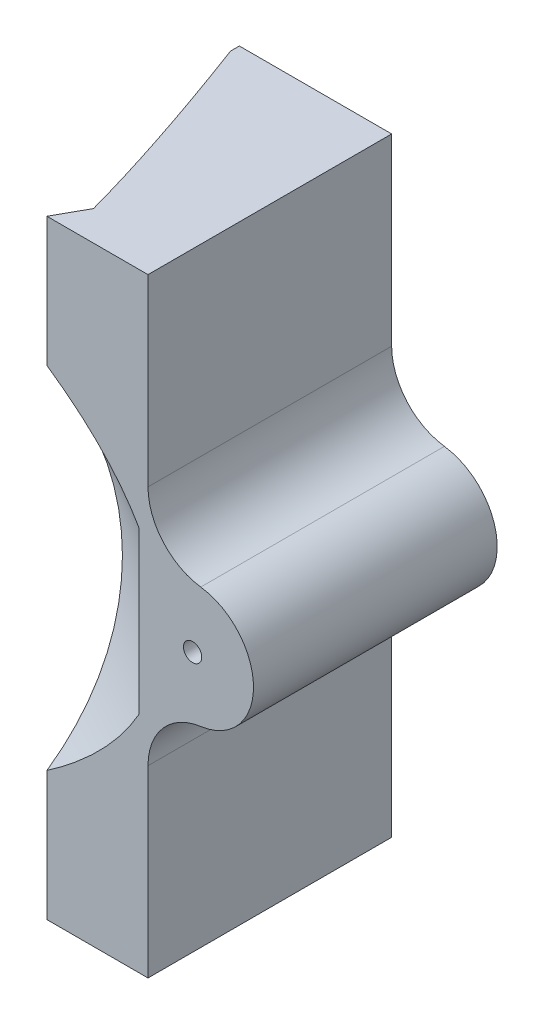
ISO-10303-21;
HEADER;
FILE_DESCRIPTION(('STEP AP214'),'2;1');
FILE_NAME('part.step','',(''),(''),'','','');
FILE_SCHEMA(('AUTOMOTIVE_DESIGN { 1 0 10303 214 1 1 1 1 }'));
ENDSEC;
DATA;
#1=APPLICATION_CONTEXT('core data for automotive mechanical design processes');
#2=APPLICATION_PROTOCOL_DEFINITION('international standard','automotive_design',2000,#1);
#3=PRODUCT_CONTEXT('',#1,'mechanical');
#4=PRODUCT('Part','Part','',(#3));
#5=PRODUCT_RELATED_PRODUCT_CATEGORY('part','',(#4));
#6=PRODUCT_DEFINITION_FORMATION('','',#4);
#7=PRODUCT_DEFINITION_CONTEXT('part definition',#1,'design');
#8=PRODUCT_DEFINITION('design','',#6,#7);
#9=PRODUCT_DEFINITION_SHAPE('','',#8);
#10=(LENGTH_UNIT() NAMED_UNIT(*) SI_UNIT(.MILLI.,.METRE.));
#11=(NAMED_UNIT(*) PLANE_ANGLE_UNIT() SI_UNIT($,.RADIAN.));
#12=(NAMED_UNIT(*) SI_UNIT($,.STERADIAN.) SOLID_ANGLE_UNIT());
#13=UNCERTAINTY_MEASURE_WITH_UNIT(LENGTH_MEASURE(1.E-05),#10,'distance_accuracy_value','');
#14=(GEOMETRIC_REPRESENTATION_CONTEXT(3) GLOBAL_UNCERTAINTY_ASSIGNED_CONTEXT((#13)) GLOBAL_UNIT_ASSIGNED_CONTEXT((#10,
#11,#12)) REPRESENTATION_CONTEXT('',''));
#15=CARTESIAN_POINT('',(0.,0.,0.));
#16=DIRECTION('',(0.,0.,1.));
#17=DIRECTION('',(1.,0.,0.));
#18=AXIS2_PLACEMENT_3D('',#15,#16,#17);
#19=CARTESIAN_POINT('',(0.,2.54,0.));
#20=DIRECTION('',(0.,0.,-1.));
#21=DIRECTION('',(-1.,0.,0.));
#22=AXIS2_PLACEMENT_3D('',#19,#20,#21);
#23=PLANE('',#22);
#24=CARTESIAN_POINT('',(0.,0.,0.));
#25=DIRECTION('',(0.,0.,1.));
#26=DIRECTION('',(1.,0.,0.));
#27=AXIS2_PLACEMENT_3D('',#24,#25,#26);
#28=CIRCLE('',#27,0.381);
#29=CARTESIAN_POINT('',(0.381,0.,0.));
#30=VERTEX_POINT('',#29);
#31=EDGE_CURVE('E287',#30,#30,#28,.T.);
#32=ORIENTED_EDGE('',*,*,#31,.F.);
#33=EDGE_LOOP('',(#32));
#34=FACE_BOUND('',#33,.T.);
#35=DIRECTION('',(0.,-1.,0.));
#36=VECTOR('',#35,1.);
#37=CARTESIAN_POINT('',(-6.07292671785097,2.54,0.));
#38=LINE('',#37,#36);
#39=CARTESIAN_POINT('',(-6.07292671785097,12.7,0.));
#40=VERTEX_POINT('',#39);
#41=CARTESIAN_POINT('',(-6.07292671785097,7.31040088364597,0.));
#42=VERTEX_POINT('',#41);
#43=EDGE_CURVE('E137',#40,#42,#38,.T.);
#44=ORIENTED_EDGE('',*,*,#43,.T.);
#45=CARTESIAN_POINT('',(-27.4936877903365,0.,0.));
#46=DIRECTION('',(0.,0.,-1.));
#47=DIRECTION('',(-1.,0.,0.));
#48=AXIS2_PLACEMENT_3D('',#45,#46,#47);
#49=ELLIPSE('',#48,26.1958498132668,12.7);
#50=CARTESIAN_POINT('',(-2.23284680713486,3.36279204819966,0.));
#51=VERTEX_POINT('',#50);
#52=EDGE_CURVE('E56',#42,#51,#49,.T.);
#53=ORIENTED_EDGE('',*,*,#52,.T.);
#54=DIRECTION('',(0.,-1.,0.));
#55=VECTOR('',#54,1.);
#56=CARTESIAN_POINT('',(-2.23284680713486,-3.36279204819966,0.));
#57=LINE('',#56,#55);
#58=CARTESIAN_POINT('',(-2.23284680713486,-3.36279204819966,0.));
#59=VERTEX_POINT('',#58);
#60=EDGE_CURVE('E49',#51,#59,#57,.T.);
#61=ORIENTED_EDGE('',*,*,#60,.T.);
#62=CARTESIAN_POINT('',(-6.07292671785097,-7.31040088364597,0.));
#63=VERTEX_POINT('',#62);
#64=EDGE_CURVE('E132',#59,#63,#49,.T.);
#65=ORIENTED_EDGE('',*,*,#64,.T.);
#66=CARTESIAN_POINT('',(-6.07292671785097,-12.7,0.));
#67=VERTEX_POINT('',#66);
#68=EDGE_CURVE('E147',#63,#67,#38,.T.);
#69=ORIENTED_EDGE('',*,*,#68,.T.);
#70=DIRECTION('',(1.,0.,0.));
#71=VECTOR('',#70,1.);
#72=CARTESIAN_POINT('',(-1.85934640522876,-12.7,0.));
#73=LINE('',#72,#71);
#74=CARTESIAN_POINT('',(-1.85934640522876,-12.7,0.));
#75=VERTEX_POINT('',#74);
#76=EDGE_CURVE('E260',#67,#75,#73,.T.);
#77=ORIENTED_EDGE('',*,*,#76,.T.);
#78=DIRECTION('',(0.,-1.,0.));
#79=VECTOR('',#78,1.);
#80=CARTESIAN_POINT('',(-1.85934640522876,12.7,0.));
#81=LINE('',#80,#79);
#82=CARTESIAN_POINT('',(-1.85934640522876,-5.03419414444109,0.));
#83=VERTEX_POINT('',#82);
#84=EDGE_CURVE('E256',#83,#75,#81,.T.);
#85=ORIENTED_EDGE('',*,*,#84,.F.);
#86=CARTESIAN_POINT('',(0.680653594771242,-5.03419414444109,0.));
#87=DIRECTION('',(0.,0.,-1.));
#88=DIRECTION('',(-1.,0.,0.));
#89=AXIS2_PLACEMENT_3D('',#86,#87,#88);
#90=CIRCLE('',#89,2.54);
#91=CARTESIAN_POINT('',(0.340326797385621,-2.51709707222055,0.));
#92=VERTEX_POINT('',#91);
#93=EDGE_CURVE('E243',#83,#92,#90,.T.);
#94=ORIENTED_EDGE('',*,*,#93,.T.);
#95=CARTESIAN_POINT('',(0.,0.,0.));
#96=DIRECTION('',(0.,0.,1.));
#97=DIRECTION('',(1.,0.,0.));
#98=AXIS2_PLACEMENT_3D('',#95,#96,#97);
#99=CIRCLE('',#98,2.54);
#100=CARTESIAN_POINT('',(0.340326797385621,2.51709707222055,0.));
#101=VERTEX_POINT('',#100);
#102=EDGE_CURVE('E278',#92,#101,#99,.T.);
#103=ORIENTED_EDGE('',*,*,#102,.T.);
#104=CARTESIAN_POINT('',(0.680653594771242,5.03419414444109,0.));
#105=DIRECTION('',(0.,0.,-1.));
#106=DIRECTION('',(-1.,0.,0.));
#107=AXIS2_PLACEMENT_3D('',#104,#105,#106);
#108=CIRCLE('',#107,2.54);
#109=CARTESIAN_POINT('',(-1.85934640522876,5.03419414444109,0.));
#110=VERTEX_POINT('',#109);
#111=EDGE_CURVE('E11',#101,#110,#108,.T.);
#112=ORIENTED_EDGE('',*,*,#111,.T.);
#113=CARTESIAN_POINT('',(-1.85934640522876,12.7,0.));
#114=VERTEX_POINT('',#113);
#115=EDGE_CURVE('E262',#114,#110,#81,.T.);
#116=ORIENTED_EDGE('',*,*,#115,.F.);
#117=DIRECTION('',(1.,0.,0.));
#118=VECTOR('',#117,1.);
#119=CARTESIAN_POINT('',(-1.85934640522876,12.7,0.));
#120=LINE('',#119,#118);
#121=EDGE_CURVE('E263',#40,#114,#120,.T.);
#122=ORIENTED_EDGE('',*,*,#121,.F.);
#123=EDGE_LOOP('',(#44,#53,#61,#65,#69,#77,#85,#94,#103,#112,#116,#122));
#124=FACE_BOUND('',#123,.T.);
#125=ADVANCED_FACE('F34',(#34,#124),#23,.F.);
#126=CARTESIAN_POINT('',(-8.20934640522876,12.7,0.));
#127=DIRECTION('',(1.,0.,0.));
#128=DIRECTION('',(0.,0.,-1.));
#129=AXIS2_PLACEMENT_3D('',#126,#127,#128);
#130=PLANE('',#129);
#131=DIRECTION('',(0.,-1.,0.));
#132=VECTOR('',#131,1.);
#133=CARTESIAN_POINT('',(-8.20934640522876,12.7,-10.16));
#134=LINE('',#133,#132);
#135=CARTESIAN_POINT('',(-8.20934640522876,12.7,-10.16));
#136=VERTEX_POINT('',#135);
#137=CARTESIAN_POINT('',(-8.20934640522876,12.4537988819033,-10.16));
#138=VERTEX_POINT('',#137);
#139=EDGE_CURVE('E272',#136,#138,#134,.T.);
#140=ORIENTED_EDGE('',*,*,#139,.T.);
#141=CARTESIAN_POINT('',(-8.20934640522876,0.,2.87882139577951));
#142=DIRECTION('',(1.,0.,0.));
#143=DIRECTION('',(0.,0.,-1.));
#144=AXIS2_PLACEMENT_3D('',#141,#142,#143);
#145=ELLIPSE('',#144,20.2082033696624,16.3009268514571);
#146=CARTESIAN_POINT('',(-8.20934640522876,12.7,-9.78977481130625));
#147=VERTEX_POINT('',#146);
#148=EDGE_CURVE('E152',#138,#147,#145,.T.);
#149=ORIENTED_EDGE('',*,*,#148,.T.);
#150=DIRECTION('',(0.,0.,1.));
#151=VECTOR('',#150,1.);
#152=CARTESIAN_POINT('',(-8.20934640522876,12.7,0.));
#153=LINE('',#152,#151);
#154=EDGE_CURVE('E267',#136,#147,#153,.T.);
#155=ORIENTED_EDGE('',*,*,#154,.F.);
#156=EDGE_LOOP('',(#140,#149,#155));
#157=FACE_BOUND('',#156,.T.);
#158=ADVANCED_FACE('F205',(#157),#130,.F.);
#159=CARTESIAN_POINT('',(0.,0.,0.));
#160=DIRECTION('',(0.,0.,1.));
#161=DIRECTION('',(1.,0.,0.));
#162=AXIS2_PLACEMENT_3D('',#159,#160,#161);
#163=CYLINDRICAL_SURFACE('',#162,2.54);
#164=ORIENTED_EDGE('',*,*,#102,.F.);
#165=DIRECTION('',(0.,0.,1.));
#166=VECTOR('',#165,1.);
#167=CARTESIAN_POINT('',(0.340326797385621,-2.51709707222055,0.));
#168=LINE('',#167,#166);
#169=CARTESIAN_POINT('',(0.340326797385621,-2.51709707222055,-10.16));
#170=VERTEX_POINT('',#169);
#171=EDGE_CURVE('E238',#92,#170,#168,.F.);
#172=ORIENTED_EDGE('',*,*,#171,.T.);
#173=CARTESIAN_POINT('',(0.,0.,-10.16));
#174=DIRECTION('',(0.,0.,1.));
#175=DIRECTION('',(1.,0.,0.));
#176=AXIS2_PLACEMENT_3D('',#173,#174,#175);
#177=CIRCLE('',#176,2.54);
#178=CARTESIAN_POINT('',(0.340326797385621,2.51709707222055,-10.16));
#179=VERTEX_POINT('',#178);
#180=EDGE_CURVE('E280',#170,#179,#177,.T.);
#181=ORIENTED_EDGE('',*,*,#180,.T.);
#182=DIRECTION('',(0.,0.,1.));
#183=VECTOR('',#182,1.);
#184=CARTESIAN_POINT('',(0.340326797385621,2.51709707222055,0.));
#185=LINE('',#184,#183);
#186=EDGE_CURVE('E250',#179,#101,#185,.T.);
#187=ORIENTED_EDGE('',*,*,#186,.T.);
#188=EDGE_LOOP('',(#164,#172,#181,#187));
#189=FACE_BOUND('',#188,.T.);
#190=ADVANCED_FACE('F209',(#189),#163,.T.);
#191=CARTESIAN_POINT('',(0.,0.,0.));
#192=DIRECTION('',(0.,0.,1.));
#193=DIRECTION('',(1.,0.,0.));
#194=AXIS2_PLACEMENT_3D('',#191,#192,#193);
#195=CYLINDRICAL_SURFACE('',#194,0.381);
#196=CARTESIAN_POINT('',(0.,0.,-7.62));
#197=DIRECTION('',(0.,0.,1.));
#198=DIRECTION('',(1.,0.,0.));
#199=AXIS2_PLACEMENT_3D('',#196,#197,#198);
#200=CIRCLE('',#199,0.381);
#201=CARTESIAN_POINT('',(-0.381,0.,-7.62));
#202=VERTEX_POINT('',#201);
#203=EDGE_CURVE('E285',#202,#202,#200,.T.);
#204=ORIENTED_EDGE('',*,*,#203,.F.);
#205=EDGE_LOOP('',(#204));
#206=FACE_BOUND('',#205,.T.);
#207=ORIENTED_EDGE('',*,*,#31,.T.);
#208=EDGE_LOOP('',(#207));
#209=FACE_BOUND('',#208,.T.);
#210=ADVANCED_FACE('F211',(#206,#209),#195,.F.);
#211=CARTESIAN_POINT('',(0.,0.,-7.62));
#212=DIRECTION('',(0.,0.,-1.));
#213=DIRECTION('',(-1.,0.,0.));
#214=AXIS2_PLACEMENT_3D('',#211,#212,#213);
#215=CONICAL_SURFACE('',#214,0.381,0.502843210927861);
#216=CARTESIAN_POINT('',(0.,0.,-10.16));
#217=DIRECTION('',(0.,0.,1.));
#218=DIRECTION('',(1.,0.,0.));
#219=AXIS2_PLACEMENT_3D('',#216,#217,#218);
#220=CIRCLE('',#219,1.778);
#221=CARTESIAN_POINT('',(-1.778,0.,-10.16));
#222=VERTEX_POINT('',#221);
#223=EDGE_CURVE('E282',#222,#222,#220,.T.);
#224=CARTESIAN_POINT('',(-1.778,0.,-10.16));
#225=CARTESIAN_POINT('',(-1.76344791666667,0.,-10.1335416666667));
#226=CARTESIAN_POINT('',(-1.74889583333333,0.,-10.1070833333333));
#227=CARTESIAN_POINT('',(-1.71979166666667,0.,-10.0541666666667));
#228=CARTESIAN_POINT('',(-1.70523958333333,0.,-10.0277083333333));
#229=CARTESIAN_POINT('',(-1.67613541666667,0.,-9.97479166666667));
#230=CARTESIAN_POINT('',(-1.66158333333333,0.,-9.94833333333334));
#231=CARTESIAN_POINT('',(-1.63247916666667,0.,-9.89541666666667));
#232=CARTESIAN_POINT('',(-1.61792708333333,0.,-9.86895833333333));
#233=CARTESIAN_POINT('',(-1.58882291666667,0.,-9.81604166666667));
#234=CARTESIAN_POINT('',(-1.57427083333333,0.,-9.78958333333333));
#235=CARTESIAN_POINT('',(-1.54516666666667,0.,-9.73666666666667));
#236=CARTESIAN_POINT('',(-1.53061458333333,0.,-9.71020833333333));
#237=CARTESIAN_POINT('',(-1.50151041666667,0.,-9.65729166666667));
#238=CARTESIAN_POINT('',(-1.48695833333333,0.,-9.63083333333334));
#239=CARTESIAN_POINT('',(-1.45785416666667,0.,-9.57791666666667));
#240=CARTESIAN_POINT('',(-1.44330208333333,0.,-9.55145833333334));
#241=CARTESIAN_POINT('',(-1.41419791666667,0.,-9.49854166666667));
#242=CARTESIAN_POINT('',(-1.39964583333333,0.,-9.47208333333333));
#243=CARTESIAN_POINT('',(-1.37054166666667,0.,-9.41916666666667));
#244=CARTESIAN_POINT('',(-1.35598958333333,0.,-9.39270833333333));
#245=CARTESIAN_POINT('',(-1.32688541666667,0.,-9.33979166666667));
#246=CARTESIAN_POINT('',(-1.31233333333333,0.,-9.31333333333333));
#247=CARTESIAN_POINT('',(-1.28322916666667,0.,-9.26041666666667));
#248=CARTESIAN_POINT('',(-1.26867708333333,0.,-9.23395833333334));
#249=CARTESIAN_POINT('',(-1.23957291666667,0.,-9.18104166666667));
#250=CARTESIAN_POINT('',(-1.22502083333333,0.,-9.15458333333333));
#251=CARTESIAN_POINT('',(-1.19591666666667,0.,-9.10166666666667));
#252=CARTESIAN_POINT('',(-1.18136458333333,0.,-9.07520833333333));
#253=CARTESIAN_POINT('',(-1.15226041666667,0.,-9.02229166666667));
#254=CARTESIAN_POINT('',(-1.13770833333333,0.,-8.99583333333334));
#255=CARTESIAN_POINT('',(-1.10860416666667,0.,-8.94291666666667));
#256=CARTESIAN_POINT('',(-1.09405208333333,0.,-8.91645833333333));
#257=CARTESIAN_POINT('',(-1.06494791666667,0.,-8.86354166666667));
#258=CARTESIAN_POINT('',(-1.05039583333333,0.,-8.83708333333333));
#259=CARTESIAN_POINT('',(-1.02129166666667,0.,-8.78416666666667));
#260=CARTESIAN_POINT('',(-1.00673958333333,0.,-8.75770833333334));
#261=CARTESIAN_POINT('',(-0.977635416666667,0.,-8.70479166666667));
#262=CARTESIAN_POINT('',(-0.963083333333334,0.,-8.67833333333333));
#263=CARTESIAN_POINT('',(-0.933979166666667,0.,-8.62541666666667));
#264=CARTESIAN_POINT('',(-0.919427083333334,0.,-8.59895833333334));
#265=CARTESIAN_POINT('',(-0.890322916666667,0.,-8.54604166666667));
#266=CARTESIAN_POINT('',(-0.875770833333334,0.,-8.51958333333333));
#267=CARTESIAN_POINT('',(-0.846666666666667,0.,-8.46666666666667));
#268=CARTESIAN_POINT('',(-0.832114583333334,0.,-8.44020833333333));
#269=CARTESIAN_POINT('',(-0.803010416666667,0.,-8.38729166666667));
#270=CARTESIAN_POINT('',(-0.788458333333334,0.,-8.36083333333334));
#271=CARTESIAN_POINT('',(-0.759354166666667,0.,-8.30791666666667));
#272=CARTESIAN_POINT('',(-0.744802083333334,0.,-8.28145833333333));
#273=CARTESIAN_POINT('',(-0.715697916666667,0.,-8.22854166666667));
#274=CARTESIAN_POINT('',(-0.701145833333334,0.,-8.20208333333334));
#275=CARTESIAN_POINT('',(-0.672041666666667,0.,-8.14916666666667));
#276=CARTESIAN_POINT('',(-0.657489583333334,0.,-8.12270833333333));
#277=CARTESIAN_POINT('',(-0.628385416666667,0.,-8.06979166666667));
#278=CARTESIAN_POINT('',(-0.613833333333334,0.,-8.04333333333333));
#279=CARTESIAN_POINT('',(-0.584729166666667,0.,-7.99041666666667));
#280=CARTESIAN_POINT('',(-0.570177083333334,0.,-7.96395833333334));
#281=CARTESIAN_POINT('',(-0.541072916666667,0.,-7.91104166666667));
#282=CARTESIAN_POINT('',(-0.526520833333334,0.,-7.88458333333333));
#283=CARTESIAN_POINT('',(-0.497416666666667,0.,-7.83166666666667));
#284=CARTESIAN_POINT('',(-0.482864583333334,0.,-7.80520833333333));
#285=CARTESIAN_POINT('',(-0.453760416666667,0.,-7.75229166666667));
#286=CARTESIAN_POINT('',(-0.439208333333334,0.,-7.72583333333333));
#287=CARTESIAN_POINT('',(-0.410104166666667,0.,-7.67291666666667));
#288=CARTESIAN_POINT('',(-0.395552083333334,0.,-7.64645833333334));
#289=CARTESIAN_POINT('',(-0.381,0.,-7.62));
#290=B_SPLINE_CURVE_WITH_KNOTS('',3,(#224,#225,#226,#227,#228,#229,#230,#231,#232,#233,#234,
#235,#236,#237,#238,#239,#240,#241,#242,#243,#244,#245,#246,#247,#248,#249,#250,#251,#252,#253,
#254,#255,#256,#257,#258,#259,#260,#261,#262,#263,#264,#265,#266,#267,#268,#269,#270,#271,#272,
#273,#274,#275,#276,#277,#278,#279,#280,#281,#282,#283,#284,#285,#286,#287,#288,#289),
.UNSPECIFIED.,.F.,.F.,(4,2,2,2,2,2,2,2,2,2,2,2,2,2,2,2,2,2,2,2,2,2,2,2,2,2,2,2,2,2,2,2,4),(0.,
0.0905884031709507,0.1811768063419,0.271765209512849,0.3623536126838,0.452942015854749,
0.543530419025698,0.634118822196648,0.724707225367597,0.815295628538548,0.905884031709497,
0.996472434880446,1.08706083805139,1.17764924122235,1.26823764439329,1.35882604756424,
1.44941445073519,1.54000285390614,1.63059125707709,1.72117966024804,1.81176806341899,
1.90235646658994,1.99294486976089,2.08353327293184,2.17412167610279,2.26471007927374,
2.35529848244469,2.44588688561564,2.53647528878659,2.62706369195754,2.71765209512849,
2.80824049829944,2.89882890147039),.UNSPECIFIED.);
#291=EDGE_CURVE('BSEAM217',#222,#202,#290,.T.);
#292=ORIENTED_EDGE('',*,*,#223,.F.);
#293=ORIENTED_EDGE('',*,*,#203,.T.);
#294=ORIENTED_EDGE('',*,*,#291,.T.);
#295=ORIENTED_EDGE('',*,*,#291,.F.);
#296=EDGE_LOOP('',(#292,#294,#293,#295));
#297=FACE_BOUND('',#296,.T.);
#298=ADVANCED_FACE('F217',(#297),#215,.F.);
#299=CARTESIAN_POINT('',(0.,2.54,-10.16));
#300=DIRECTION('',(0.,0.,1.));
#301=DIRECTION('',(1.,0.,0.));
#302=AXIS2_PLACEMENT_3D('',#299,#300,#301);
#303=PLANE('',#302);
#304=CARTESIAN_POINT('',(-8.20934640522876,-12.4537988819033,-10.16));
#305=VERTEX_POINT('',#304);
#306=CARTESIAN_POINT('',(-8.20934640522876,-12.7,-10.16));
#307=VERTEX_POINT('',#306);
#308=EDGE_CURVE('E266',#305,#307,#134,.T.);
#309=ORIENTED_EDGE('',*,*,#308,.F.);
#310=CARTESIAN_POINT('',(-37.3332764677712,-39.6305145506948,-10.16));
#311=CARTESIAN_POINT('',(-36.4746746291427,-39.0607897583688,-10.16));
#312=CARTESIAN_POINT('',(-35.6199004167641,-38.4852453970361,-10.16));
#313=CARTESIAN_POINT('',(-33.9191288591294,-37.3211605408302,-10.16));
#314=CARTESIAN_POINT('',(-33.0731323914387,-36.7326187645802,-10.16));
#315=CARTESIAN_POINT('',(-31.3893091372656,-35.5399490902637,-10.16));
#316=CARTESIAN_POINT('',(-30.5515051176034,-34.9357889926455,-10.16));
#317=CARTESIAN_POINT('',(-28.8875695593339,-33.7116276498552,-10.16));
#318=CARTESIAN_POINT('',(-28.0614377074817,-33.0916268310579,-10.16));
#319=CARTESIAN_POINT('',(-26.3935138551494,-31.8116124791757,-10.16));
#320=CARTESIAN_POINT('',(-25.552210995948,-31.1509602229062,-10.16));
#321=CARTESIAN_POINT('',(-23.8866132823773,-29.8084358293763,-10.16));
#322=CARTESIAN_POINT('',(-23.0623190886878,-29.1265628703956,-10.16));
#323=CARTESIAN_POINT('',(-21.4347205050326,-27.7395838935849,-10.16));
#324=CARTESIAN_POINT('',(-20.631398269252,-27.0344988652975,-10.16));
#325=CARTESIAN_POINT('',(-19.049124182603,-25.5975105333037,-10.16));
#326=CARTESIAN_POINT('',(-18.2701699287352,-24.8656098895181,-10.16));
#327=CARTESIAN_POINT('',(-17.0412344600779,-23.6640864316583,-10.16));
#328=CARTESIAN_POINT('',(-16.5819010771497,-23.2040157825472,-10.16));
#329=CARTESIAN_POINT('',(-15.6757057467252,-22.2717655202962,-10.16));
#330=CARTESIAN_POINT('',(-15.2288431835433,-21.7995865071639,-10.16));
#331=CARTESIAN_POINT('',(-14.3490502422715,-20.8419081953628,-10.16));
#332=CARTESIAN_POINT('',(-13.916127842936,-20.3564015529815,-10.16));
#333=CARTESIAN_POINT('',(-13.0665292154739,-19.371354946891,-10.16));
#334=CARTESIAN_POINT('',(-12.6498527183355,-18.8718152157881,-10.16));
#335=CARTESIAN_POINT('',(-11.8394528242873,-17.8630603316058,-10.16));
#336=CARTESIAN_POINT('',(-11.4455336403778,-17.3540028669951,-10.16));
#337=CARTESIAN_POINT('',(-10.6786789702979,-16.3202029107679,-10.16));
#338=CARTESIAN_POINT('',(-10.3057451959472,-15.7954591449207,-10.16));
#339=CARTESIAN_POINT('',(-9.58455330666874,-14.7301380887898,-10.16));
#340=CARTESIAN_POINT('',(-9.23626667795014,-14.1895801523091,-10.16));
#341=CARTESIAN_POINT('',(-8.56764905365507,-13.091467181183,-10.16));
#342=CARTESIAN_POINT('',(-8.24731221779796,-12.5339157304499,-10.16));
#343=CARTESIAN_POINT('',(-7.81623507099293,-11.7317076536674,-10.16));
#344=CARTESIAN_POINT('',(-7.69218358422826,-11.4941484775544,-10.16));
#345=CARTESIAN_POINT('',(-7.45001422717088,-11.0160466722909,-10.16));
#346=CARTESIAN_POINT('',(-7.33189575719434,-10.7755043477411,-10.16));
#347=CARTESIAN_POINT('',(-7.10167897474485,-10.2909216220145,-10.16));
#348=CARTESIAN_POINT('',(-6.98959402535238,-10.0468748596384,-10.16));
#349=CARTESIAN_POINT('',(-6.77205299527125,-9.55579510104407,-10.16));
#350=CARTESIAN_POINT('',(-6.66659836778204,-9.30876146422646,-10.16));
#351=CARTESIAN_POINT('',(-6.30076421988685,-8.41709925329911,-10.16));
#352=CARTESIAN_POINT('',(-6.06031683749309,-7.76409559046032,-10.16));
#353=CARTESIAN_POINT('',(-5.63274801247409,-6.44062252440663,-10.16));
#354=CARTESIAN_POINT('',(-5.44563949400246,-5.77014893105811,-10.16));
#355=CARTESIAN_POINT('',(-5.13081347277693,-4.41578172560677,-10.16));
#356=CARTESIAN_POINT('',(-5.00305160990495,-3.73189853665054,-10.16));
#357=CARTESIAN_POINT('',(-4.81135285180689,-2.35524890467689,-10.16));
#358=CARTESIAN_POINT('',(-4.74740753215241,-1.6624836464149,-10.16));
#359=CARTESIAN_POINT('',(-4.68635629252365,-0.286032433328648,-10.16));
#360=CARTESIAN_POINT('',(-4.68811068307084,0.397602677257922,-10.16));
#361=CARTESIAN_POINT('',(-4.75556998664645,1.76168122072865,-10.16));
#362=CARTESIAN_POINT('',(-4.82127508230917,2.44212464449222,-10.16));
#363=CARTESIAN_POINT('',(-5.01414031484941,3.79408067172769,-10.16));
#364=CARTESIAN_POINT('',(-5.14129274881339,4.46559438377142,-10.16));
#365=CARTESIAN_POINT('',(-5.45262941420129,5.79520836555695,-10.16));
#366=CARTESIAN_POINT('',(-5.63682140840521,6.45330679654936,-10.16));
#367=CARTESIAN_POINT('',(-6.11493704916187,7.93306721076336,-10.16));
#368=CARTESIAN_POINT('',(-6.42512603476947,8.74947408257228,-10.16));
#369=CARTESIAN_POINT('',(-7.11697443155606,10.3513287730049,-10.16));
#370=CARTESIAN_POINT('',(-7.4986616469347,11.1367644032195,-10.16));
#371=CARTESIAN_POINT('',(-8.32524751179403,12.6826377564825,-10.16));
#372=CARTESIAN_POINT('',(-8.77068893230221,13.442783546877,-10.16));
#373=CARTESIAN_POINT('',(-9.47609761932077,14.5589863729742,-10.16));
#374=CARTESIAN_POINT('',(-9.71742324033514,14.9270261813137,-10.16));
#375=CARTESIAN_POINT('',(-10.2114155481378,15.6554507741727,-10.16));
#376=CARTESIAN_POINT('',(-10.4640826564178,16.015835273458,-10.16));
#377=CARTESIAN_POINT('',(-11.0412521320971,16.8143597879789,-10.16));
#378=CARTESIAN_POINT('',(-11.3684989955425,17.2505142031771,-10.16));
#379=CARTESIAN_POINT('',(-12.0369884564768,18.1119982810004,-10.16));
#380=CARTESIAN_POINT('',(-12.3782323378969,18.5373269447663,-10.16));
#381=CARTESIAN_POINT('',(-13.0732556498564,19.3778408884217,-10.16));
#382=CARTESIAN_POINT('',(-13.4270392435496,19.7930227208157,-10.16));
#383=CARTESIAN_POINT('',(-14.1456987885433,20.6136873682383,-10.16));
#384=CARTESIAN_POINT('',(-14.5105753785401,21.019169622388,-10.16));
#385=CARTESIAN_POINT('',(-15.6221835130529,22.2242523778216,-10.16));
#386=CARTESIAN_POINT('',(-16.3838865178141,23.0100852730487,-10.16));
#387=CARTESIAN_POINT('',(-17.9390800503159,24.5491406453085,-10.16));
#388=CARTESIAN_POINT('',(-18.7325654571311,25.3023683354703,-10.16));
#389=CARTESIAN_POINT('',(-20.308415723878,26.7461265823694,-10.16));
#390=CARTESIAN_POINT('',(-21.0896031351862,27.4379462958646,-10.16));
#391=CARTESIAN_POINT('',(-22.6718533183016,28.7985337045169,-10.16));
#392=CARTESIAN_POINT('',(-23.4729177098312,29.4672995103929,-10.16));
#393=CARTESIAN_POINT('',(-25.0857977484626,30.7794031674694,-10.16));
#394=CARTESIAN_POINT('',(-25.8974907616258,31.4228920185925,-10.16));
#395=CARTESIAN_POINT('',(-27.1254384670616,32.374415643232,-10.16));
#396=CARTESIAN_POINT('',(-27.5364363928356,32.6892662627849,-10.16));
#397=CARTESIAN_POINT('',(-28.361684214551,33.3146588276433,-10.16));
#398=CARTESIAN_POINT('',(-28.7759340403206,33.6252008655246,-10.16));
#399=CARTESIAN_POINT('',(-29.1916935799695,33.9337114594324,-10.16));
#400=B_SPLINE_CURVE_WITH_KNOTS('',3,(#310,#311,#312,#313,#314,#315,#316,#317,#318,#319,#320,
#321,#322,#323,#324,#325,#326,#327,#328,#329,#330,#331,#332,#333,#334,#335,#336,#337,#338,#339,
#340,#341,#342,#343,#344,#345,#346,#347,#348,#349,#350,#351,#352,#353,#354,#355,#356,#357,#358,
#359,#360,#361,#362,#363,#364,#365,#366,#367,#368,#369,#370,#371,#372,#373,#374,#375,#376,#377,
#378,#379,#380,#381,#382,#383,#384,#385,#386,#387,#388,#389,#390,#391,#392,#393,#394,#395,#396,
#397,#398,#399),.UNSPECIFIED.,.F.,.F.,(4,2,2,2,2,2,2,2,2,2,2,2,2,2,2,2,2,2,2,2,2,2,2,2,2,2,2,2,
2,2,2,2,2,2,2,2,2,2,2,2,2,2,2,2,4),(0.,3.09130467113264,6.18291547753922,9.28150876887055,
12.3800187449913,15.5888095479108,18.7977247584447,22.0038139686482,25.2095860137568,
27.1597428134075,29.1098031626812,31.0609604898435,33.0120854945475,34.9426249003098,
36.873321556234,38.801746822615,40.7297681628234,41.5336985890466,42.337547593247,
43.1431093199418,43.9488469943737,46.034200359082,48.1200585820021,50.2043551599716,
52.2883765533265,54.3362635606748,56.3841564165206,58.4317926192448,60.4797076168986,
63.0955766915894,65.7124651440898,68.35312796086,69.6732728220856,70.9934667854837,
72.6289584959321,74.264600565216,75.9007908458432,77.5370755117102,80.8190275746786,
84.1004529451773,87.2304046824183,90.3606123141912,93.4677661575893,95.0209499911591,
96.5741004006148),.UNSPECIFIED.);
#401=EDGE_CURVE('E151',#305,#138,#400,.T.);
#402=ORIENTED_EDGE('',*,*,#401,.T.);
#403=ORIENTED_EDGE('',*,*,#139,.F.);
#404=DIRECTION('',(-1.,0.,0.));
#405=VECTOR('',#404,1.);
#406=CARTESIAN_POINT('',(-1.85934640522876,12.7,-10.16));
#407=LINE('',#406,#405);
#408=CARTESIAN_POINT('',(-1.85934640522876,12.7,-10.16));
#409=VERTEX_POINT('',#408);
#410=EDGE_CURVE('E313',#409,#136,#407,.T.);
#411=ORIENTED_EDGE('',*,*,#410,.F.);
#412=DIRECTION('',(0.,-1.,0.));
#413=VECTOR('',#412,1.);
#414=CARTESIAN_POINT('',(-1.85934640522876,12.7,-10.16));
#415=LINE('',#414,#413);
#416=CARTESIAN_POINT('',(-1.85934640522876,5.03419414444109,-10.16));
#417=VERTEX_POINT('',#416);
#418=EDGE_CURVE('E275',#409,#417,#415,.T.);
#419=ORIENTED_EDGE('',*,*,#418,.T.);
#420=CARTESIAN_POINT('',(0.680653594771242,5.03419414444109,-10.16));
#421=DIRECTION('',(0.,0.,1.));
#422=DIRECTION('',(1.,0.,0.));
#423=AXIS2_PLACEMENT_3D('',#420,#421,#422);
#424=CIRCLE('',#423,2.54);
#425=EDGE_CURVE('E42',#417,#179,#424,.T.);
#426=ORIENTED_EDGE('',*,*,#425,.T.);
#427=ORIENTED_EDGE('',*,*,#180,.F.);
#428=CARTESIAN_POINT('',(0.680653594771242,-5.03419414444109,-10.16));
#429=DIRECTION('',(0.,0.,1.));
#430=DIRECTION('',(1.,0.,0.));
#431=AXIS2_PLACEMENT_3D('',#428,#429,#430);
#432=CIRCLE('',#431,2.54);
#433=CARTESIAN_POINT('',(-1.85934640522876,-5.03419414444109,-10.16));
#434=VERTEX_POINT('',#433);
#435=EDGE_CURVE('E237',#170,#434,#432,.T.);
#436=ORIENTED_EDGE('',*,*,#435,.T.);
#437=CARTESIAN_POINT('',(-1.85934640522876,-12.7,-10.16));
#438=VERTEX_POINT('',#437);
#439=EDGE_CURVE('E258',#434,#438,#415,.T.);
#440=ORIENTED_EDGE('',*,*,#439,.T.);
#441=DIRECTION('',(-1.,0.,0.));
#442=VECTOR('',#441,1.);
#443=CARTESIAN_POINT('',(-1.85934640522876,-12.7,-10.16));
#444=LINE('',#443,#442);
#445=EDGE_CURVE('E305',#438,#307,#444,.T.);
#446=ORIENTED_EDGE('',*,*,#445,.T.);
#447=EDGE_LOOP('',(#309,#402,#403,#411,#419,#426,#427,#436,#440,#446));
#448=FACE_BOUND('',#447,.T.);
#449=ORIENTED_EDGE('',*,*,#223,.T.);
#450=EDGE_LOOP('',(#449));
#451=FACE_BOUND('',#450,.T.);
#452=ADVANCED_FACE('F166',(#448,#451),#303,.F.);
#453=CARTESIAN_POINT('',(-1.85934640522876,12.7,0.));
#454=DIRECTION('',(-1.,0.,0.));
#455=DIRECTION('',(0.,0.,1.));
#456=AXIS2_PLACEMENT_3D('',#453,#454,#455);
#457=PLANE('',#456);
#458=ORIENTED_EDGE('',*,*,#439,.F.);
#459=DIRECTION('',(0.,0.,-1.));
#460=VECTOR('',#459,1.);
#461=CARTESIAN_POINT('',(-1.85934640522876,-5.03419414444109,0.));
#462=LINE('',#461,#460);
#463=EDGE_CURVE('E191',#434,#83,#462,.F.);
#464=ORIENTED_EDGE('',*,*,#463,.T.);
#465=ORIENTED_EDGE('',*,*,#84,.T.);
#466=DIRECTION('',(0.,0.,-1.));
#467=VECTOR('',#466,1.);
#468=CARTESIAN_POINT('',(-1.85934640522876,-12.7,0.));
#469=LINE('',#468,#467);
#470=EDGE_CURVE('E306',#75,#438,#469,.T.);
#471=ORIENTED_EDGE('',*,*,#470,.T.);
#472=EDGE_LOOP('',(#458,#464,#465,#471));
#473=FACE_BOUND('',#472,.T.);
#474=ADVANCED_FACE('F206',(#473),#457,.F.);
#475=ORIENTED_EDGE('',*,*,#115,.T.);
#476=DIRECTION('',(0.,0.,-1.));
#477=VECTOR('',#476,1.);
#478=CARTESIAN_POINT('',(-1.85934640522876,5.03419414444109,-10.16));
#479=LINE('',#478,#477);
#480=EDGE_CURVE('E245',#110,#417,#479,.T.);
#481=ORIENTED_EDGE('',*,*,#480,.T.);
#482=ORIENTED_EDGE('',*,*,#418,.F.);
#483=DIRECTION('',(0.,0.,-1.));
#484=VECTOR('',#483,1.);
#485=CARTESIAN_POINT('',(-1.85934640522876,12.7,0.));
#486=LINE('',#485,#484);
#487=EDGE_CURVE('E308',#114,#409,#486,.T.);
#488=ORIENTED_EDGE('',*,*,#487,.F.);
#489=EDGE_LOOP('',(#475,#481,#482,#488));
#490=FACE_BOUND('',#489,.T.);
#491=ADVANCED_FACE('F203',(#490),#457,.F.);
#492=DIRECTION('',(0.,0.,1.));
#493=VECTOR('',#492,1.);
#494=CARTESIAN_POINT('',(-8.20934640522876,-12.7,0.));
#495=LINE('',#494,#493);
#496=CARTESIAN_POINT('',(-8.20934640522876,-12.7,-9.78977481130626));
#497=VERTEX_POINT('',#496);
#498=EDGE_CURVE('E301',#307,#497,#495,.T.);
#499=ORIENTED_EDGE('',*,*,#498,.T.);
#500=EDGE_CURVE('E146',#497,#305,#145,.T.);
#501=ORIENTED_EDGE('',*,*,#500,.T.);
#502=ORIENTED_EDGE('',*,*,#308,.T.);
#503=EDGE_LOOP('',(#499,#501,#502));
#504=FACE_BOUND('',#503,.T.);
#505=ADVANCED_FACE('F200',(#504),#130,.F.);
#506=CARTESIAN_POINT('',(0.,12.7,0.));
#507=DIRECTION('',(0.,1.,0.));
#508=DIRECTION('',(0.,0.,1.));
#509=AXIS2_PLACEMENT_3D('',#506,#507,#508);
#510=PLANE('',#509);
#511=CARTESIAN_POINT('',(-16.5101373207113,12.7,-29.6376839395393));
#512=CARTESIAN_POINT('',(-16.1264481200852,12.7,-28.7771375530465));
#513=CARTESIAN_POINT('',(-15.7443058871239,12.7,-27.9158978597572));
#514=CARTESIAN_POINT('',(-14.9837721712555,12.7,-26.1917468816681));
#515=CARTESIAN_POINT('',(-14.6053807528577,12.7,-25.3288355684226));
#516=CARTESIAN_POINT('',(-13.8528128266708,12.7,-23.600613125427));
#517=CARTESIAN_POINT('',(-13.4786387389334,12.7,-22.7353009407663));
#518=CARTESIAN_POINT('',(-12.7356064343064,12.7,-21.0024015097759));
#519=CARTESIAN_POINT('',(-12.3667481839052,12.7,-20.1348142778291));
#520=CARTESIAN_POINT('',(-11.6283794949898,12.7,-18.3800601244249));
#521=CARTESIAN_POINT('',(-11.2589953327011,12.7,-17.4928399905931));
#522=CARTESIAN_POINT('',(-10.5285058083151,12.7,-15.7149998151602));
#523=CARTESIAN_POINT('',(-10.1674003817962,12.7,-14.8243798000785));
#524=CARTESIAN_POINT('',(-9.45566904710153,12.7,-13.0391661080923));
#525=CARTESIAN_POINT('',(-9.1050409719255,12.7,-12.144573297454));
#526=CARTESIAN_POINT('',(-8.41713947390865,12.7,-10.3502857825411));
#527=CARTESIAN_POINT('',(-8.07986558079183,12.7,-9.45059125920461));
#528=CARTESIAN_POINT('',(-7.46161229548097,12.7,-7.75130246865457));
#529=CARTESIAN_POINT('',(-7.17868578983656,12.7,-6.9524210008615));
#530=CARTESIAN_POINT('',(-6.76770094436098,12.7,-5.74948027220606));
#531=CARTESIAN_POINT('',(-6.63293419369765,12.7,-5.34771148705496));
#532=CARTESIAN_POINT('',(-6.36858341803242,12.7,-4.54246935976925));
#533=CARTESIAN_POINT('',(-6.23899937698039,12.7,-4.13899602291767));
#534=CARTESIAN_POINT('',(-5.98661496667754,12.7,-3.33259975270055));
#535=CARTESIAN_POINT('',(-5.86377839706185,12.7,-2.92968817652534));
#536=CARTESIAN_POINT('',(-5.62507489706214,12.7,-2.1218075325606));
#537=CARTESIAN_POINT('',(-5.50920782911944,12.7,-1.71683850555067));
#538=CARTESIAN_POINT('',(-5.2857028790728,12.7,-0.904621909130223));
#539=CARTESIAN_POINT('',(-5.17806507095984,12.7,-0.497374319268007));
#540=CARTESIAN_POINT('',(-4.97261396543917,12.7,0.319581881227329));
#541=CARTESIAN_POINT('',(-4.87480013879884,12.7,0.729290358027219));
#542=CARTESIAN_POINT('',(-4.67905209567885,12.7,1.60478453370575));
#543=CARTESIAN_POINT('',(-4.58275365374378,12.7,2.07093944291382));
#544=CARTESIAN_POINT('',(-4.40904074537214,12.7,3.00659899595964));
#545=CARTESIAN_POINT('',(-4.33161675513442,12.7,3.47610182686943));
#546=CARTESIAN_POINT('',(-4.23322142747486,12.7,4.18417388897608));
#547=CARTESIAN_POINT('',(-4.20332065123994,12.7,4.42150998245187));
#548=CARTESIAN_POINT('',(-4.15037617513955,12.7,4.89693209677002));
#549=CARTESIAN_POINT('',(-4.12733180828271,12.7,5.13501804238811));
#550=CARTESIAN_POINT('',(-4.0889657209851,12.7,5.61220480843166));
#551=CARTESIAN_POINT('',(-4.07365624761877,12.7,5.85130663758895));
#552=CARTESIAN_POINT('',(-4.05188659721801,12.7,6.32998853580283));
#553=CARTESIAN_POINT('',(-4.04542946102174,12.7,6.56956874089781));
#554=CARTESIAN_POINT('',(-4.04394025582016,12.7,6.80922472227939));
#555=B_SPLINE_CURVE_WITH_KNOTS('',3,(#511,#512,#513,#514,#515,#516,#517,#518,#519,#520,#521,
#522,#523,#524,#525,#526,#527,#528,#529,#530,#531,#532,#533,#534,#535,#536,#537,#538,#539,#540,
#541,#542,#543,#544,#545,#546,#547,#548,#549,#550,#551,#552,#553,#554),.UNSPECIFIED.,.F.,.F.,(4,
2,2,2,2,2,2,2,2,2,2,2,2,2,2,2,2,2,2,2,2,4),(0.,2.8266298262869,5.65330818295445,
8.48153351279358,11.3097410054573,14.1928374973091,17.0759115465004,19.9583851114939,
22.840757077906,25.3830789446779,26.6543581007089,27.9256333194636,29.189241137552,
30.4528240073279,31.7164182369036,32.9799443582099,34.4076475636092,35.834628870587,
36.5521843723886,37.2696700475653,37.9882882240215,38.7071531889193),.UNSPECIFIED.);
#556=CARTESIAN_POINT('',(-5.38053326224747,12.7,-1.24911085934612));
#557=VERTEX_POINT('',#556);
#558=EDGE_CURVE('E160',#557,#147,#555,.F.);
#559=ORIENTED_EDGE('',*,*,#558,.F.);
#560=DIRECTION('',(0.484809620246338,0.,-0.874619707139395));
#561=VECTOR('',#560,1.);
#562=CARTESIAN_POINT('',(-4.64554378795836,12.7,-2.57506697058551));
#563=LINE('',#562,#561);
#564=EDGE_CURVE('E141',#40,#557,#563,.T.);
#565=ORIENTED_EDGE('',*,*,#564,.F.);
#566=ORIENTED_EDGE('',*,*,#121,.T.);
#567=ORIENTED_EDGE('',*,*,#487,.T.);
#568=ORIENTED_EDGE('',*,*,#410,.T.);
#569=ORIENTED_EDGE('',*,*,#154,.T.);
#570=EDGE_LOOP('',(#559,#565,#566,#567,#568,#569));
#571=FACE_BOUND('',#570,.T.);
#572=ADVANCED_FACE('F178',(#571),#510,.T.);
#573=CARTESIAN_POINT('',(0.,-12.7,0.));
#574=DIRECTION('',(0.,1.,0.));
#575=DIRECTION('',(0.,0.,1.));
#576=AXIS2_PLACEMENT_3D('',#573,#574,#575);
#577=PLANE('',#576);
#578=DIRECTION('',(0.484809620246338,0.,-0.874619707139395));
#579=VECTOR('',#578,1.);
#580=CARTESIAN_POINT('',(-4.64554378795836,-12.7,-2.57506697058551));
#581=LINE('',#580,#579);
#582=CARTESIAN_POINT('',(-5.38053326224747,-12.7,-1.24911085934612));
#583=VERTEX_POINT('',#582);
#584=EDGE_CURVE('E192',#67,#583,#581,.T.);
#585=ORIENTED_EDGE('',*,*,#584,.T.);
#586=CARTESIAN_POINT('',(-16.5101373207113,-12.7,-29.6376839395393));
#587=CARTESIAN_POINT('',(-16.1264481200852,-12.7,-28.7771375530465));
#588=CARTESIAN_POINT('',(-15.7443058871239,-12.7,-27.9158978597572));
#589=CARTESIAN_POINT('',(-14.9837721712555,-12.7,-26.1917468816681));
#590=CARTESIAN_POINT('',(-14.6053807528577,-12.7,-25.3288355684226));
#591=CARTESIAN_POINT('',(-13.8528128266708,-12.7,-23.600613125427));
#592=CARTESIAN_POINT('',(-13.4786387389334,-12.7,-22.7353009407663));
#593=CARTESIAN_POINT('',(-12.7356064343064,-12.7,-21.0024015097759));
#594=CARTESIAN_POINT('',(-12.3667481839052,-12.7,-20.1348142778291));
#595=CARTESIAN_POINT('',(-11.6283794949898,-12.7,-18.3800601244249));
#596=CARTESIAN_POINT('',(-11.2589953327011,-12.7,-17.492839990593));
#597=CARTESIAN_POINT('',(-10.5285058083151,-12.7,-15.7149998151602));
#598=CARTESIAN_POINT('',(-10.1674003817962,-12.7,-14.8243798000785));
#599=CARTESIAN_POINT('',(-9.45566904710153,-12.7,-13.0391661080923));
#600=CARTESIAN_POINT('',(-9.10504097192551,-12.7,-12.144573297454));
#601=CARTESIAN_POINT('',(-8.41713947390865,-12.7,-10.3502857825411));
#602=CARTESIAN_POINT('',(-8.07986558079183,-12.7,-9.45059125920462));
#603=CARTESIAN_POINT('',(-7.46161229548097,-12.7,-7.75130246865458));
#604=CARTESIAN_POINT('',(-7.17868578983656,-12.7,-6.95242100086151));
#605=CARTESIAN_POINT('',(-6.76770094436098,-12.7,-5.74948027220607));
#606=CARTESIAN_POINT('',(-6.63293419369765,-12.7,-5.34771148705497));
#607=CARTESIAN_POINT('',(-6.36858341803242,-12.7,-4.54246935976926));
#608=CARTESIAN_POINT('',(-6.23899937698039,-12.7,-4.13899602291768));
#609=CARTESIAN_POINT('',(-5.98661496667754,-12.7,-3.33259975270056));
#610=CARTESIAN_POINT('',(-5.86377839706185,-12.7,-2.92968817652535));
#611=CARTESIAN_POINT('',(-5.62507489706215,-12.7,-2.12180753256062));
#612=CARTESIAN_POINT('',(-5.50920782911944,-12.7,-1.71683850555068));
#613=CARTESIAN_POINT('',(-5.2857028790728,-12.7,-0.904621909130235));
#614=CARTESIAN_POINT('',(-5.17806507095985,-12.7,-0.497374319268018));
#615=CARTESIAN_POINT('',(-4.97261396543918,-12.7,0.319581881227317));
#616=CARTESIAN_POINT('',(-4.87480013879885,-12.7,0.729290358027206));
#617=CARTESIAN_POINT('',(-4.67905209567885,-12.7,1.60478453370574));
#618=CARTESIAN_POINT('',(-4.58275365374378,-12.7,2.07093944291381));
#619=CARTESIAN_POINT('',(-4.40904074537215,-12.7,3.00659899595964));
#620=CARTESIAN_POINT('',(-4.33161675513442,-12.7,3.47610182686943));
#621=CARTESIAN_POINT('',(-4.23322142747486,-12.7,4.18417388897608));
#622=CARTESIAN_POINT('',(-4.20332065123994,-12.7,4.42150998245187));
#623=CARTESIAN_POINT('',(-4.15037617513955,-12.7,4.89693209677003));
#624=CARTESIAN_POINT('',(-4.12733180828272,-12.7,5.13501804238812));
#625=CARTESIAN_POINT('',(-4.08896572098511,-12.7,5.61220480843167));
#626=CARTESIAN_POINT('',(-4.07365624761877,-12.7,5.85130663758896));
#627=CARTESIAN_POINT('',(-4.05188659721801,-12.7,6.32998853580284));
#628=CARTESIAN_POINT('',(-4.04542946102174,-12.7,6.56956874089782));
#629=CARTESIAN_POINT('',(-4.04394025582016,-12.7,6.8092247222794));
#630=B_SPLINE_CURVE_WITH_KNOTS('',3,(#586,#587,#588,#589,#590,#591,#592,#593,#594,#595,#596,
#597,#598,#599,#600,#601,#602,#603,#604,#605,#606,#607,#608,#609,#610,#611,#612,#613,#614,#615,
#616,#617,#618,#619,#620,#621,#622,#623,#624,#625,#626,#627,#628,#629),.UNSPECIFIED.,.F.,.F.,(4,
2,2,2,2,2,2,2,2,2,2,2,2,2,2,2,2,2,2,2,2,4),(0.,2.8266298262869,5.65330818295446,
8.48153351279359,11.3097410054574,14.1928374973091,17.0759115465004,19.9583851114939,
22.840757077906,25.3830789446779,26.6543581007089,27.9256333194636,29.189241137552,
30.4528240073279,31.7164182369036,32.9799443582099,34.4076475636092,35.834628870587,
36.5521843723886,37.2696700475654,37.9882882240215,38.7071531889193),.UNSPECIFIED.);
#631=EDGE_CURVE('E184',#583,#497,#630,.F.);
#632=ORIENTED_EDGE('',*,*,#631,.T.);
#633=ORIENTED_EDGE('',*,*,#498,.F.);
#634=ORIENTED_EDGE('',*,*,#445,.F.);
#635=ORIENTED_EDGE('',*,*,#470,.F.);
#636=ORIENTED_EDGE('',*,*,#76,.F.);
#637=EDGE_LOOP('',(#585,#632,#633,#634,#635,#636));
#638=FACE_BOUND('',#637,.T.);
#639=ADVANCED_FACE('F195',(#638),#577,.F.);
#640=CARTESIAN_POINT('',(-17.2647524577988,0.,20.1905881035418));
#641=DIRECTION('',(0.874619707139395,0.,0.484809620246338));
#642=DIRECTION('',(0.,1.,0.));
#643=AXIS2_PLACEMENT_3D('',#640,#641,#642);
#644=PLANE('',#643);
#645=ORIENTED_EDGE('',*,*,#68,.F.);
#646=CARTESIAN_POINT('',(-11.1076702806703,0.,9.08291782287152));
#647=DIRECTION('',(-0.874619707139395,0.,-0.484809620246338));
#648=DIRECTION('',(-0.484809620246338,0.,0.874619707139395));
#649=AXIS2_PLACEMENT_3D('',#646,#647,#648);
#650=CIRCLE('',#649,12.7);
#651=EDGE_CURVE('E133',#42,#63,#650,.T.);
#652=ORIENTED_EDGE('',*,*,#651,.F.);
#653=ORIENTED_EDGE('',*,*,#43,.F.);
#654=ORIENTED_EDGE('',*,*,#564,.T.);
#655=CARTESIAN_POINT('',(-11.1076702806703,0.,9.08291782287152));
#656=DIRECTION('',(-0.874619707139395,0.,-0.484809620246338));
#657=DIRECTION('',(0.,-1.,0.));
#658=AXIS2_PLACEMENT_3D('',#655,#656,#657);
#659=CIRCLE('',#658,17.3447662168724);
#660=EDGE_CURVE('E138',#557,#583,#659,.T.);
#661=ORIENTED_EDGE('',*,*,#660,.T.);
#662=ORIENTED_EDGE('',*,*,#584,.F.);
#663=EDGE_LOOP('',(#645,#652,#653,#654,#661,#662));
#664=FACE_BOUND('',#663,.T.);
#665=ADVANCED_FACE('F175',(#664),#644,.F.);
#666=CARTESIAN_POINT('',(-41.9205225631913,0.,-7.99692509840698));
#667=DIRECTION('',(-0.874619707139395,0.,-0.484809620246338));
#668=DIRECTION('',(0.,-1.,0.));
#669=AXIS2_PLACEMENT_3D('',#666,#667,#668);
#670=CONICAL_SURFACE('',#669,41.91,0.608899261517194);
#671=ORIENTED_EDGE('',*,*,#558,.T.);
#672=ORIENTED_EDGE('',*,*,#148,.F.);
#673=ORIENTED_EDGE('',*,*,#401,.F.);
#674=ORIENTED_EDGE('',*,*,#500,.F.);
#675=ORIENTED_EDGE('',*,*,#631,.F.);
#676=ORIENTED_EDGE('',*,*,#660,.F.);
#677=EDGE_LOOP('',(#671,#672,#673,#674,#675,#676));
#678=FACE_BOUND('',#677,.T.);
#679=ADVANCED_FACE('F170',(#678),#670,.F.);
#680=CARTESIAN_POINT('',(0.680653594771242,-5.03419414444109,0.));
#681=DIRECTION('',(0.,0.,1.));
#682=DIRECTION('',(1.,0.,0.));
#683=AXIS2_PLACEMENT_3D('',#680,#681,#682);
#684=CYLINDRICAL_SURFACE('',#683,2.54);
#685=ORIENTED_EDGE('',*,*,#435,.F.);
#686=ORIENTED_EDGE('',*,*,#171,.F.);
#687=ORIENTED_EDGE('',*,*,#93,.F.);
#688=ORIENTED_EDGE('',*,*,#463,.F.);
#689=EDGE_LOOP('',(#685,#686,#687,#688));
#690=FACE_BOUND('',#689,.T.);
#691=ADVANCED_FACE('F174',(#690),#684,.F.);
#692=CARTESIAN_POINT('',(0.680653594771242,5.03419414444109,0.));
#693=DIRECTION('',(0.,0.,1.));
#694=DIRECTION('',(1.,0.,0.));
#695=AXIS2_PLACEMENT_3D('',#692,#693,#694);
#696=CYLINDRICAL_SURFACE('',#695,2.54);
#697=ORIENTED_EDGE('',*,*,#111,.F.);
#698=ORIENTED_EDGE('',*,*,#186,.F.);
#699=ORIENTED_EDGE('',*,*,#425,.F.);
#700=ORIENTED_EDGE('',*,*,#480,.F.);
#701=EDGE_LOOP('',(#697,#698,#699,#700));
#702=FACE_BOUND('',#701,.T.);
#703=ADVANCED_FACE('F36',(#702),#696,.F.);
#704=CARTESIAN_POINT('',(11.1076702806703,0.,21.3970821771285));
#705=DIRECTION('',(-0.874619707139395,0.,-0.484809620246338));
#706=DIRECTION('',(-0.484809620246338,0.,0.874619707139395));
#707=AXIS2_PLACEMENT_3D('',#704,#705,#706);
#708=CYLINDRICAL_SURFACE('',#707,12.7);
#709=ORIENTED_EDGE('',*,*,#64,.F.);
#710=CARTESIAN_POINT('',(-2.23284680713486,0.,14.0023128042978));
#711=DIRECTION('',(-1.,0.,0.));
#712=DIRECTION('',(0.,0.,-1.));
#713=AXIS2_PLACEMENT_3D('',#710,#711,#712);
#714=ELLIPSE('',#713,14.5205966619912,12.7);
#715=EDGE_CURVE('E128',#51,#59,#714,.T.);
#716=ORIENTED_EDGE('',*,*,#715,.F.);
#717=ORIENTED_EDGE('',*,*,#52,.F.);
#718=ORIENTED_EDGE('',*,*,#651,.T.);
#719=EDGE_LOOP('',(#709,#716,#717,#718));
#720=FACE_BOUND('',#719,.T.);
#721=ADVANCED_FACE('F131',(#720),#708,.F.);
#722=CARTESIAN_POINT('',(-2.23284680713486,-3.36279204819966,-500000.));
#723=DIRECTION('',(-1.,0.,0.));
#724=DIRECTION('',(0.,-1.,0.));
#725=AXIS2_PLACEMENT_3D('',#722,#723,#724);
#726=PLANE('',#725);
#727=ORIENTED_EDGE('',*,*,#60,.F.);
#728=ORIENTED_EDGE('',*,*,#715,.T.);
#729=EDGE_LOOP('',(#727,#728));
#730=FACE_BOUND('',#729,.T.);
#731=ADVANCED_FACE('F127',(#730),#726,.T.);
#732=CLOSED_SHELL('',(#125,#158,#190,#210,#298,#452,#474,#491,#505,#572,#639,#665,#679,#691,
#703,#721,#731));
#733=MANIFOLD_SOLID_BREP('B2',#732);
#734=ADVANCED_BREP_SHAPE_REPRESENTATION('',(#18,#733),#14);
#735=SHAPE_DEFINITION_REPRESENTATION(#9,#734);
ENDSEC;
END-ISO-10303-21;
